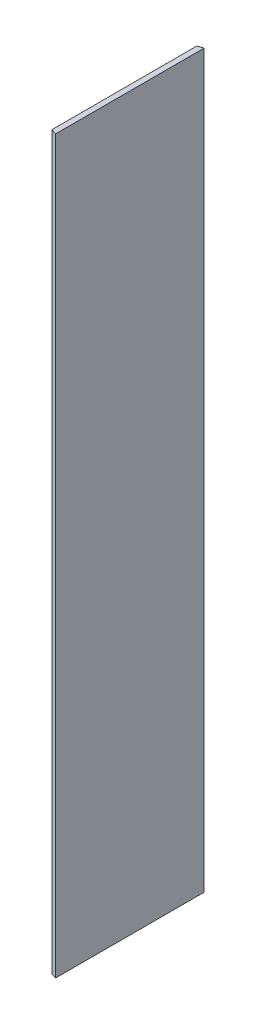
ISO-10303-21;
HEADER;
FILE_DESCRIPTION(('STEP AP214'),'2;1');
FILE_NAME('part.step','',(''),(''),'','','');
FILE_SCHEMA(('AUTOMOTIVE_DESIGN { 1 0 10303 214 1 1 1 1 }'));
ENDSEC;
DATA;
#1=APPLICATION_CONTEXT('core data for automotive mechanical design processes');
#2=APPLICATION_PROTOCOL_DEFINITION('international standard','automotive_design',2000,#1);
#3=PRODUCT_CONTEXT('',#1,'mechanical');
#4=PRODUCT('Part','Part','',(#3));
#5=PRODUCT_RELATED_PRODUCT_CATEGORY('part','',(#4));
#6=PRODUCT_DEFINITION_FORMATION('','',#4);
#7=PRODUCT_DEFINITION_CONTEXT('part definition',#1,'design');
#8=PRODUCT_DEFINITION('design','',#6,#7);
#9=PRODUCT_DEFINITION_SHAPE('','',#8);
#10=(LENGTH_UNIT() NAMED_UNIT(*) SI_UNIT(.MILLI.,.METRE.));
#11=(NAMED_UNIT(*) PLANE_ANGLE_UNIT() SI_UNIT($,.RADIAN.));
#12=(NAMED_UNIT(*) SI_UNIT($,.STERADIAN.) SOLID_ANGLE_UNIT());
#13=UNCERTAINTY_MEASURE_WITH_UNIT(LENGTH_MEASURE(1.E-05),#10,'distance_accuracy_value','');
#14=(GEOMETRIC_REPRESENTATION_CONTEXT(3) GLOBAL_UNCERTAINTY_ASSIGNED_CONTEXT((#13)) GLOBAL_UNIT_ASSIGNED_CONTEXT((#10,
#11,#12)) REPRESENTATION_CONTEXT('',''));
#15=CARTESIAN_POINT('',(0.,0.,0.));
#16=DIRECTION('',(0.,0.,1.));
#17=DIRECTION('',(1.,0.,0.));
#18=AXIS2_PLACEMENT_3D('',#15,#16,#17);
#19=CARTESIAN_POINT('',(5.00964471624499,641.622334644927,-0.498838058256568));
#20=DIRECTION('',(0.315319093395393,0.,0.948985705551094));
#21=DIRECTION('',(0.948985705551094,0.,-0.315319093395393));
#22=AXIS2_PLACEMENT_3D('',#19,#20,#21);
#23=PLANE('',#22);
#24=DIRECTION('',(-0.948985705551094,0.,0.315319093395393));
#25=VECTOR('',#24,1.);
#26=CARTESIAN_POINT('',(5.00964471624498,533.213673316679,-0.498838058256566));
#27=LINE('',#26,#25);
#28=CARTESIAN_POINT('',(5.00964471624499,533.213673316679,-0.498838058256568));
#29=VERTEX_POINT('',#28);
#30=CARTESIAN_POINT('',(1.00964471624496,533.213673316679,0.830240310578434));
#31=VERTEX_POINT('',#30);
#32=EDGE_CURVE('E81',#29,#31,#27,.T.);
#33=ORIENTED_EDGE('',*,*,#32,.F.);
#34=DIRECTION('',(0.,-1.,0.));
#35=VECTOR('',#34,1.);
#36=CARTESIAN_POINT('',(5.00964471624499,641.622334644927,-0.498838058256568));
#37=LINE('',#36,#35);
#38=CARTESIAN_POINT('',(5.00964471624499,0.,-0.498838058256568));
#39=VERTEX_POINT('',#38);
#40=EDGE_CURVE('E35',#29,#39,#37,.T.);
#41=ORIENTED_EDGE('',*,*,#40,.T.);
#42=DIRECTION('',(-0.948985705551094,0.,0.315319093395393));
#43=VECTOR('',#42,1.);
#44=CARTESIAN_POINT('',(5.00964471624499,0.,-0.498838058256568));
#45=LINE('',#44,#43);
#46=CARTESIAN_POINT('',(1.00964471624496,0.,0.830240310578434));
#47=VERTEX_POINT('',#46);
#48=EDGE_CURVE('E79',#39,#47,#45,.T.);
#49=ORIENTED_EDGE('',*,*,#48,.T.);
#50=DIRECTION('',(0.,-1.,0.));
#51=VECTOR('',#50,1.);
#52=CARTESIAN_POINT('',(1.00964471624496,641.622334644927,0.830240310578434));
#53=LINE('',#52,#51);
#54=EDGE_CURVE('E70',#31,#47,#53,.T.);
#55=ORIENTED_EDGE('',*,*,#54,.F.);
#56=EDGE_LOOP('',(#33,#41,#49,#55));
#57=FACE_BOUND('',#56,.T.);
#58=ADVANCED_FACE('F31',(#57),#23,.F.);
#59=CARTESIAN_POINT('',(1.00964471624496,641.622334644927,0.830240310578434));
#60=DIRECTION('',(1.,0.,0.));
#61=DIRECTION('',(0.,0.,-1.));
#62=AXIS2_PLACEMENT_3D('',#59,#60,#61);
#63=PLANE('',#62);
#64=DIRECTION('',(0.,0.,1.));
#65=VECTOR('',#64,1.);
#66=CARTESIAN_POINT('',(1.00964471624496,533.213673316679,0.830240310578422));
#67=LINE('',#66,#65);
#68=CARTESIAN_POINT('',(1.00964471624497,533.213673316679,106.580095425794));
#69=VERTEX_POINT('',#68);
#70=EDGE_CURVE('E40',#31,#69,#67,.T.);
#71=ORIENTED_EDGE('',*,*,#70,.F.);
#72=ORIENTED_EDGE('',*,*,#54,.T.);
#73=DIRECTION('',(0.,0.,1.));
#74=VECTOR('',#73,1.);
#75=CARTESIAN_POINT('',(1.00964471624496,0.,0.830240310578434));
#76=LINE('',#75,#74);
#77=CARTESIAN_POINT('',(1.00964471624497,0.,106.580095425794));
#78=VERTEX_POINT('',#77);
#79=EDGE_CURVE('E91',#47,#78,#76,.T.);
#80=ORIENTED_EDGE('',*,*,#79,.T.);
#81=DIRECTION('',(0.,-1.,0.));
#82=VECTOR('',#81,1.);
#83=CARTESIAN_POINT('',(1.00964471624497,641.622334644927,106.580095425794));
#84=LINE('',#83,#82);
#85=EDGE_CURVE('E100',#69,#78,#84,.T.);
#86=ORIENTED_EDGE('',*,*,#85,.F.);
#87=EDGE_LOOP('',(#71,#72,#80,#86));
#88=FACE_BOUND('',#87,.T.);
#89=ADVANCED_FACE('F104',(#88),#63,.F.);
#90=CARTESIAN_POINT('',(1.00964471624497,641.622334644927,106.580095425794));
#91=DIRECTION('',(0.299558496706871,0.,-0.954077935522418));
#92=DIRECTION('',(-0.954077935522418,0.,-0.299558496706871));
#93=AXIS2_PLACEMENT_3D('',#90,#91,#92);
#94=PLANE('',#93);
#95=DIRECTION('',(0.954077935522418,0.,0.299558496706871));
#96=VECTOR('',#95,1.);
#97=CARTESIAN_POINT('',(1.00964471624496,533.213673316679,106.580095425794));
#98=LINE('',#97,#96);
#99=CARTESIAN_POINT('',(5.00964471624496,533.213673316679,107.836003294758));
#100=VERTEX_POINT('',#99);
#101=EDGE_CURVE('E11',#69,#100,#98,.T.);
#102=ORIENTED_EDGE('',*,*,#101,.F.);
#103=ORIENTED_EDGE('',*,*,#85,.T.);
#104=DIRECTION('',(0.954077935522418,0.,0.299558496706871));
#105=VECTOR('',#104,1.);
#106=CARTESIAN_POINT('',(1.00964471624497,0.,106.580095425794));
#107=LINE('',#106,#105);
#108=CARTESIAN_POINT('',(5.00964471624496,0.,107.836003294758));
#109=VERTEX_POINT('',#108);
#110=EDGE_CURVE('E101',#78,#109,#107,.T.);
#111=ORIENTED_EDGE('',*,*,#110,.T.);
#112=DIRECTION('',(0.,-1.,0.));
#113=VECTOR('',#112,1.);
#114=CARTESIAN_POINT('',(5.00964471624496,641.622334644927,107.836003294758));
#115=LINE('',#114,#113);
#116=EDGE_CURVE('E53',#100,#109,#115,.T.);
#117=ORIENTED_EDGE('',*,*,#116,.F.);
#118=EDGE_LOOP('',(#102,#103,#111,#117));
#119=FACE_BOUND('',#118,.T.);
#120=ADVANCED_FACE('F103',(#119),#94,.F.);
#121=CARTESIAN_POINT('',(5.00964471624496,641.622334644927,107.836003294758));
#122=DIRECTION('',(-1.,0.,0.));
#123=DIRECTION('',(0.,0.,1.));
#124=AXIS2_PLACEMENT_3D('',#121,#122,#123);
#125=PLANE('',#124);
#126=DIRECTION('',(0.,0.,-1.));
#127=VECTOR('',#126,1.);
#128=CARTESIAN_POINT('',(5.00964471624496,533.213673316679,107.836003294758));
#129=LINE('',#128,#127);
#130=EDGE_CURVE('E88',#100,#29,#129,.T.);
#131=ORIENTED_EDGE('',*,*,#130,.F.);
#132=ORIENTED_EDGE('',*,*,#116,.T.);
#133=DIRECTION('',(0.,0.,-1.));
#134=VECTOR('',#133,1.);
#135=CARTESIAN_POINT('',(5.00964471624496,0.,107.836003294758));
#136=LINE('',#135,#134);
#137=EDGE_CURVE('E84',#109,#39,#136,.T.);
#138=ORIENTED_EDGE('',*,*,#137,.T.);
#139=ORIENTED_EDGE('',*,*,#40,.F.);
#140=EDGE_LOOP('',(#131,#132,#138,#139));
#141=FACE_BOUND('',#140,.T.);
#142=ADVANCED_FACE('F85',(#141),#125,.F.);
#143=CARTESIAN_POINT('',(1.00964471624496,0.,0.830240310578434));
#144=DIRECTION('',(0.,1.,0.));
#145=DIRECTION('',(0.,0.,1.));
#146=AXIS2_PLACEMENT_3D('',#143,#144,#145);
#147=PLANE('',#146);
#148=ORIENTED_EDGE('',*,*,#48,.F.);
#149=ORIENTED_EDGE('',*,*,#137,.F.);
#150=ORIENTED_EDGE('',*,*,#110,.F.);
#151=ORIENTED_EDGE('',*,*,#79,.F.);
#152=EDGE_LOOP('',(#148,#149,#150,#151));
#153=FACE_BOUND('',#152,.T.);
#154=ADVANCED_FACE('F90',(#153),#147,.F.);
#155=CARTESIAN_POINT('',(-157.897483649013,533.213673316679,25.5300025529366));
#156=DIRECTION('',(0.,1.,0.));
#157=DIRECTION('',(-0.759435060713234,0.,-0.65058311425942));
#158=AXIS2_PLACEMENT_3D('',#155,#156,#157);
#159=PLANE('',#158);
#160=ORIENTED_EDGE('',*,*,#130,.T.);
#161=ORIENTED_EDGE('',*,*,#32,.T.);
#162=ORIENTED_EDGE('',*,*,#70,.T.);
#163=ORIENTED_EDGE('',*,*,#101,.T.);
#164=EDGE_LOOP('',(#160,#161,#162,#163));
#165=FACE_BOUND('',#164,.T.);
#166=ADVANCED_FACE('F33',(#165),#159,.T.);
#167=CLOSED_SHELL('',(#58,#89,#120,#142,#154,#166));
#168=MANIFOLD_SOLID_BREP('B2',#167);
#169=ADVANCED_BREP_SHAPE_REPRESENTATION('',(#18,#168),#14);
#170=SHAPE_DEFINITION_REPRESENTATION(#9,#169);
ENDSEC;
END-ISO-10303-21;
